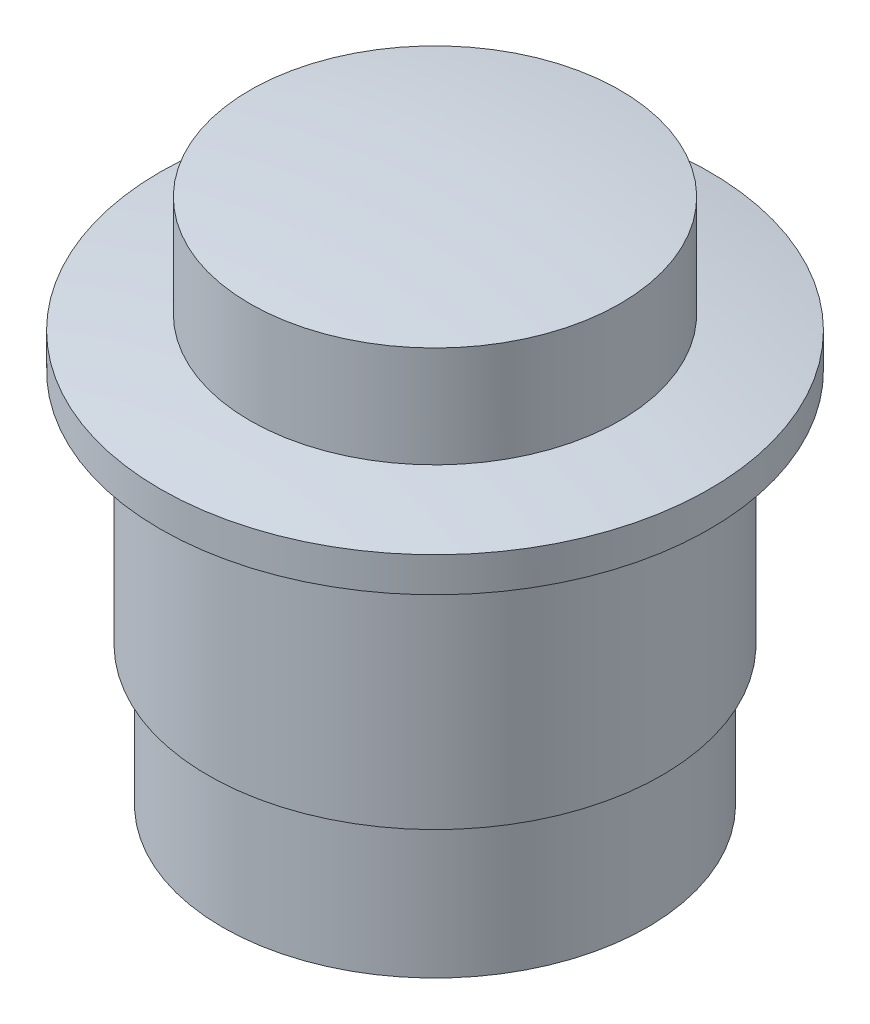
ISO-10303-21;
HEADER;
FILE_DESCRIPTION(('STEP AP214'),'2;1');
FILE_NAME('part.step','',(''),(''),'','','');
FILE_SCHEMA(('AUTOMOTIVE_DESIGN { 1 0 10303 214 1 1 1 1 }'));
ENDSEC;
DATA;
#1=APPLICATION_CONTEXT('core data for automotive mechanical design processes');
#2=APPLICATION_PROTOCOL_DEFINITION('international standard','automotive_design',2000,#1);
#3=PRODUCT_CONTEXT('',#1,'mechanical');
#4=PRODUCT('Part','Part','',(#3));
#5=PRODUCT_RELATED_PRODUCT_CATEGORY('part','',(#4));
#6=PRODUCT_DEFINITION_FORMATION('','',#4);
#7=PRODUCT_DEFINITION_CONTEXT('part definition',#1,'design');
#8=PRODUCT_DEFINITION('design','',#6,#7);
#9=PRODUCT_DEFINITION_SHAPE('','',#8);
#10=(LENGTH_UNIT() NAMED_UNIT(*) SI_UNIT(.MILLI.,.METRE.));
#11=(NAMED_UNIT(*) PLANE_ANGLE_UNIT() SI_UNIT($,.RADIAN.));
#12=(NAMED_UNIT(*) SI_UNIT($,.STERADIAN.) SOLID_ANGLE_UNIT());
#13=UNCERTAINTY_MEASURE_WITH_UNIT(LENGTH_MEASURE(1.E-05),#10,'distance_accuracy_value','');
#14=(GEOMETRIC_REPRESENTATION_CONTEXT(3) GLOBAL_UNCERTAINTY_ASSIGNED_CONTEXT((#13)) GLOBAL_UNIT_ASSIGNED_CONTEXT((#10,
#11,#12)) REPRESENTATION_CONTEXT('',''));
#15=CARTESIAN_POINT('',(0.,0.,0.));
#16=DIRECTION('',(0.,0.,1.));
#17=DIRECTION('',(1.,0.,0.));
#18=AXIS2_PLACEMENT_3D('',#15,#16,#17);
#19=CARTESIAN_POINT('',(0.,4.8,0.));
#20=DIRECTION('',(0.,-1.,0.));
#21=DIRECTION('',(0.,0.,-1.));
#22=AXIS2_PLACEMENT_3D('',#19,#20,#21);
#23=CYLINDRICAL_SURFACE('',#22,7.35);
#24=CARTESIAN_POINT('',(0.,4.8,0.));
#25=DIRECTION('',(0.,1.,0.));
#26=DIRECTION('',(0.,0.,1.));
#27=AXIS2_PLACEMENT_3D('',#24,#25,#26);
#28=CIRCLE('',#27,7.35);
#29=CARTESIAN_POINT('',(0.,4.8,7.35));
#30=VERTEX_POINT('',#29);
#31=EDGE_CURVE('E11',#30,#30,#28,.T.);
#32=ORIENTED_EDGE('',*,*,#31,.F.);
#33=EDGE_LOOP('',(#32));
#34=FACE_BOUND('',#33,.T.);
#35=CARTESIAN_POINT('',(0.,0.,0.));
#36=DIRECTION('',(0.,1.,0.));
#37=DIRECTION('',(0.,0.,1.));
#38=AXIS2_PLACEMENT_3D('',#35,#36,#37);
#39=CIRCLE('',#38,7.35);
#40=CARTESIAN_POINT('',(0.,0.,7.35));
#41=VERTEX_POINT('',#40);
#42=EDGE_CURVE('E39',#41,#41,#39,.T.);
#43=ORIENTED_EDGE('',*,*,#42,.T.);
#44=EDGE_LOOP('',(#43));
#45=FACE_BOUND('',#44,.T.);
#46=ADVANCED_FACE('F36',(#34,#45),#23,.T.);
#47=CARTESIAN_POINT('',(0.,0.,0.));
#48=DIRECTION('',(0.,1.,0.));
#49=DIRECTION('',(0.,0.,1.));
#50=AXIS2_PLACEMENT_3D('',#47,#48,#49);
#51=PLANE('',#50);
#52=ORIENTED_EDGE('',*,*,#42,.F.);
#53=EDGE_LOOP('',(#52));
#54=FACE_BOUND('',#53,.T.);
#55=ADVANCED_FACE('F79',(#54),#51,.F.);
#56=CARTESIAN_POINT('',(0.,48.2031529292576,0.));
#57=DIRECTION('',(0.,-1.,0.));
#58=DIRECTION('',(0.,0.,-1.));
#59=AXIS2_PLACEMENT_3D('',#56,#57,#58);
#60=CYLINDRICAL_SURFACE('',#59,7.85);
#61=CARTESIAN_POINT('',(0.,4.8,0.));
#62=DIRECTION('',(0.,1.,0.));
#63=DIRECTION('',(0.,0.,1.));
#64=AXIS2_PLACEMENT_3D('',#61,#62,#63);
#65=CIRCLE('',#64,7.85);
#66=CARTESIAN_POINT('',(0.,4.80000000000001,-7.85));
#67=VERTEX_POINT('',#66);
#68=EDGE_CURVE('E50',#67,#67,#65,.T.);
#69=CARTESIAN_POINT('',(0.,13.,0.));
#70=DIRECTION('',(0.,1.,0.));
#71=DIRECTION('',(0.,0.,1.));
#72=AXIS2_PLACEMENT_3D('',#69,#70,#71);
#73=CIRCLE('',#72,7.85);
#74=CARTESIAN_POINT('',(0.,13.,-7.85));
#75=VERTEX_POINT('',#74);
#76=EDGE_CURVE('E46',#75,#75,#73,.T.);
#77=CARTESIAN_POINT('',(0.,4.80000000000001,-7.85));
#78=CARTESIAN_POINT('',(0.,4.88541666666667,-7.85));
#79=CARTESIAN_POINT('',(0.,4.97083333333334,-7.85));
#80=CARTESIAN_POINT('',(0.,5.14166666666667,-7.85));
#81=CARTESIAN_POINT('',(0.,5.22708333333334,-7.85));
#82=CARTESIAN_POINT('',(0.,5.39791666666667,-7.85));
#83=CARTESIAN_POINT('',(0.,5.48333333333334,-7.85));
#84=CARTESIAN_POINT('',(0.,5.65416666666667,-7.85));
#85=CARTESIAN_POINT('',(0.,5.73958333333334,-7.85));
#86=CARTESIAN_POINT('',(0.,5.91041666666667,-7.85));
#87=CARTESIAN_POINT('',(0.,5.99583333333334,-7.85));
#88=CARTESIAN_POINT('',(0.,6.16666666666667,-7.85));
#89=CARTESIAN_POINT('',(0.,6.25208333333334,-7.85));
#90=CARTESIAN_POINT('',(0.,6.42291666666667,-7.85));
#91=CARTESIAN_POINT('',(0.,6.50833333333334,-7.85));
#92=CARTESIAN_POINT('',(0.,6.67916666666667,-7.85));
#93=CARTESIAN_POINT('',(0.,6.76458333333334,-7.85));
#94=CARTESIAN_POINT('',(0.,6.93541666666667,-7.85));
#95=CARTESIAN_POINT('',(0.,7.02083333333333,-7.85));
#96=CARTESIAN_POINT('',(0.,7.19166666666667,-7.85));
#97=CARTESIAN_POINT('',(0.,7.27708333333333,-7.85));
#98=CARTESIAN_POINT('',(0.,7.44791666666667,-7.85));
#99=CARTESIAN_POINT('',(0.,7.53333333333333,-7.85));
#100=CARTESIAN_POINT('',(0.,7.70416666666667,-7.85));
#101=CARTESIAN_POINT('',(0.,7.78958333333333,-7.85));
#102=CARTESIAN_POINT('',(0.,7.96041666666667,-7.85));
#103=CARTESIAN_POINT('',(0.,8.04583333333333,-7.85));
#104=CARTESIAN_POINT('',(0.,8.21666666666667,-7.85));
#105=CARTESIAN_POINT('',(0.,8.30208333333333,-7.85));
#106=CARTESIAN_POINT('',(0.,8.47291666666666,-7.85));
#107=CARTESIAN_POINT('',(0.,8.55833333333333,-7.85));
#108=CARTESIAN_POINT('',(0.,8.72916666666666,-7.85));
#109=CARTESIAN_POINT('',(0.,8.81458333333333,-7.85));
#110=CARTESIAN_POINT('',(0.,8.98541666666666,-7.85));
#111=CARTESIAN_POINT('',(0.,9.07083333333333,-7.85));
#112=CARTESIAN_POINT('',(0.,9.24166666666666,-7.85));
#113=CARTESIAN_POINT('',(0.,9.32708333333333,-7.85));
#114=CARTESIAN_POINT('',(0.,9.49791666666666,-7.85));
#115=CARTESIAN_POINT('',(0.,9.58333333333333,-7.85));
#116=CARTESIAN_POINT('',(0.,9.75416666666666,-7.85));
#117=CARTESIAN_POINT('',(0.,9.83958333333333,-7.85));
#118=CARTESIAN_POINT('',(0.,10.0104166666667,-7.85));
#119=CARTESIAN_POINT('',(0.,10.0958333333333,-7.85));
#120=CARTESIAN_POINT('',(0.,10.2666666666667,-7.85));
#121=CARTESIAN_POINT('',(0.,10.3520833333333,-7.85));
#122=CARTESIAN_POINT('',(0.,10.5229166666667,-7.85));
#123=CARTESIAN_POINT('',(0.,10.6083333333333,-7.85));
#124=CARTESIAN_POINT('',(0.,10.7791666666667,-7.85));
#125=CARTESIAN_POINT('',(0.,10.8645833333333,-7.85));
#126=CARTESIAN_POINT('',(0.,11.0354166666667,-7.85));
#127=CARTESIAN_POINT('',(0.,11.1208333333333,-7.85));
#128=CARTESIAN_POINT('',(0.,11.2916666666667,-7.85));
#129=CARTESIAN_POINT('',(0.,11.3770833333333,-7.85));
#130=CARTESIAN_POINT('',(0.,11.5479166666667,-7.85));
#131=CARTESIAN_POINT('',(0.,11.6333333333333,-7.85));
#132=CARTESIAN_POINT('',(0.,11.8041666666667,-7.85));
#133=CARTESIAN_POINT('',(0.,11.8895833333333,-7.85));
#134=CARTESIAN_POINT('',(0.,12.0604166666667,-7.85));
#135=CARTESIAN_POINT('',(0.,12.1458333333333,-7.85));
#136=CARTESIAN_POINT('',(0.,12.3166666666667,-7.85));
#137=CARTESIAN_POINT('',(0.,12.4020833333333,-7.85));
#138=CARTESIAN_POINT('',(0.,12.5729166666667,-7.85));
#139=CARTESIAN_POINT('',(0.,12.6583333333333,-7.85));
#140=CARTESIAN_POINT('',(0.,12.8291666666667,-7.85));
#141=CARTESIAN_POINT('',(0.,12.9145833333333,-7.85));
#142=CARTESIAN_POINT('',(0.,13.,-7.85));
#143=B_SPLINE_CURVE_WITH_KNOTS('',3,(#77,#78,#79,#80,#81,#82,#83,#84,#85,#86,#87,#88,#89,#90,
#91,#92,#93,#94,#95,#96,#97,#98,#99,#100,#101,#102,#103,#104,#105,#106,#107,#108,#109,#110,#111,
#112,#113,#114,#115,#116,#117,#118,#119,#120,#121,#122,#123,#124,#125,#126,#127,#128,#129,#130,
#131,#132,#133,#134,#135,#136,#137,#138,#139,#140,#141,#142),.UNSPECIFIED.,.F.,.F.,(4,2,2,2,2,2,
2,2,2,2,2,2,2,2,2,2,2,2,2,2,2,2,2,2,2,2,2,2,2,2,2,2,4),(0.,0.25625,0.512499999999999,
0.768749999999999,1.025,1.28125,1.5375,1.79375,2.05,2.30625,2.5625,2.81874999999999,
3.07499999999999,3.33124999999999,3.58749999999999,3.84374999999999,4.09999999999999,
4.35624999999999,4.61249999999999,4.86874999999999,5.12499999999999,5.38124999999999,
5.63749999999999,5.89374999999999,6.14999999999999,6.40624999999999,6.66249999999999,
6.91874999999999,7.17499999999999,7.43124999999999,7.68749999999999,7.94374999999999,
8.19999999999999),.UNSPECIFIED.);
#144=EDGE_CURVE('BSEAM84',#67,#75,#143,.T.);
#145=ORIENTED_EDGE('',*,*,#68,.T.);
#146=ORIENTED_EDGE('',*,*,#76,.F.);
#147=ORIENTED_EDGE('',*,*,#144,.T.);
#148=ORIENTED_EDGE('',*,*,#144,.F.);
#149=EDGE_LOOP('',(#145,#147,#146,#148));
#150=FACE_BOUND('',#149,.T.);
#151=ADVANCED_FACE('F84',(#150),#60,.T.);
#152=CARTESIAN_POINT('',(0.,4.8,0.));
#153=DIRECTION('',(0.,1.,0.));
#154=DIRECTION('',(0.,0.,1.));
#155=AXIS2_PLACEMENT_3D('',#152,#153,#154);
#156=PLANE('',#155);
#157=ORIENTED_EDGE('',*,*,#31,.T.);
#158=EDGE_LOOP('',(#157));
#159=FACE_BOUND('',#158,.T.);
#160=ORIENTED_EDGE('',*,*,#68,.F.);
#161=EDGE_LOOP('',(#160));
#162=FACE_BOUND('',#161,.T.);
#163=ADVANCED_FACE('F91',(#159,#162),#156,.F.);
#164=CARTESIAN_POINT('',(0.,-31.3892045158607,0.));
#165=DIRECTION('',(0.,1.,0.));
#166=DIRECTION('',(1.,0.,0.));
#167=AXIS2_PLACEMENT_3D('',#164,#165,#166);
#168=SPHERICAL_SURFACE('',#167,50.);
#169=CARTESIAN_POINT('',(0.,18.1995038762723,0.));
#170=DIRECTION('',(0.,1.,0.));
#171=DIRECTION('',(0.,0.,1.));
#172=AXIS2_PLACEMENT_3D('',#169,#170,#171);
#173=CIRCLE('',#172,6.4);
#174=CARTESIAN_POINT('',(0.,18.1995038762723,6.4));
#175=VERTEX_POINT('',#174);
#176=EDGE_CURVE('E53',#175,#175,#173,.T.);
#177=ORIENTED_EDGE('',*,*,#176,.T.);
#178=EDGE_LOOP('',(#177));
#179=FACE_BOUND('',#178,.T.);
#180=ADVANCED_FACE('F97',(#179),#168,.T.);
#181=CARTESIAN_POINT('',(0.,15.2008910011442,0.));
#182=DIRECTION('',(0.,1.,0.));
#183=DIRECTION('',(0.,0.,1.));
#184=AXIS2_PLACEMENT_3D('',#181,#182,#183);
#185=CYLINDRICAL_SURFACE('',#184,6.4);
#186=ORIENTED_EDGE('',*,*,#176,.F.);
#187=EDGE_LOOP('',(#186));
#188=FACE_BOUND('',#187,.T.);
#189=CARTESIAN_POINT('',(0.,14.6995038762723,0.));
#190=DIRECTION('',(0.,1.,0.));
#191=DIRECTION('',(0.,0.,1.));
#192=AXIS2_PLACEMENT_3D('',#189,#190,#191);
#193=CIRCLE('',#192,6.4);
#194=CARTESIAN_POINT('',(-6.4,14.6995038762723,0.));
#195=VERTEX_POINT('',#194);
#196=EDGE_CURVE('E56',#195,#195,#193,.T.);
#197=ORIENTED_EDGE('',*,*,#196,.T.);
#198=EDGE_LOOP('',(#197));
#199=FACE_BOUND('',#198,.T.);
#200=ADVANCED_FACE('F100',(#188,#199),#185,.T.);
#201=CARTESIAN_POINT('',(0.,-34.8892045158607,0.));
#202=DIRECTION('',(0.,1.,0.));
#203=DIRECTION('',(-1.,0.,0.));
#204=AXIS2_PLACEMENT_3D('',#201,#202,#203);
#205=SPHERICAL_SURFACE('',#204,50.);
#206=CARTESIAN_POINT('',(0.,14.2,0.));
#207=DIRECTION('',(0.,1.,0.));
#208=DIRECTION('',(0.,0.,1.));
#209=AXIS2_PLACEMENT_3D('',#206,#207,#208);
#210=CIRCLE('',#209,9.5);
#211=CARTESIAN_POINT('',(-9.5,14.2,0.));
#212=VERTEX_POINT('',#211);
#213=EDGE_CURVE('E59',#212,#212,#210,.T.);
#214=CARTESIAN_POINT('',(-9.5,14.2,0.));
#215=CARTESIAN_POINT('',(-9.46788235564776,14.2062155748209,0.));
#216=CARTESIAN_POINT('',(-9.43575861127334,14.2123996290898,0.));
#217=CARTESIAN_POINT('',(-9.37149904627785,14.2247046728902,0.));
#218=CARTESIAN_POINT('',(-9.33936322565677,14.2308256624218,0.));
#219=CARTESIAN_POINT('',(-9.27507963196569,14.2430045531142,0.));
#220=CARTESIAN_POINT('',(-9.24293185889568,14.2490624542752,0.));
#221=CARTESIAN_POINT('',(-9.17862448416298,14.2611151449013,0.));
#222=CARTESIAN_POINT('',(-9.14646488250028,14.2671099343665,0.));
#223=CARTESIAN_POINT('',(-9.08213397448066,14.2790363785018,0.));
#224=CARTESIAN_POINT('',(-9.04996266812373,14.2849680331718,0.));
#225=CARTESIAN_POINT('',(-8.98560847466012,14.2967681848653,0.));
#226=CARTESIAN_POINT('',(-8.95342558755342,14.3026366818887,0.));
#227=CARTESIAN_POINT('',(-8.8890483565791,14.3143104956794,0.));
#228=CARTESIAN_POINT('',(-8.85685401271148,14.3201158124467,0.));
#229=CARTESIAN_POINT('',(-8.79245399224833,14.3316632433595,0.));
#230=CARTESIAN_POINT('',(-8.76024831565281,14.3374053575051,0.));
#231=CARTESIAN_POINT('',(-8.69582575381055,14.3488263610521,0.));
#232=CARTESIAN_POINT('',(-8.66360886856381,14.3545052504535,0.));
#233=CARTESIAN_POINT('',(-8.59916401353898,14.3657997826337,0.));
#234=CARTESIAN_POINT('',(-8.5669360437609,14.3714154254125,0.));
#235=CARTESIAN_POINT('',(-8.50246914383594,14.3825834427122,0.));
#236=CARTESIAN_POINT('',(-8.47023021368907,14.3881358172332,0.));
#237=CARTESIAN_POINT('',(-8.40574151723135,14.3991772766261,0.));
#238=CARTESIAN_POINT('',(-8.37349175092051,14.404666361498,0.));
#239=CARTESIAN_POINT('',(-8.30898150638138,14.4155812204455,0.));
#240=CARTESIAN_POINT('',(-8.2767210281531,14.421006994521,0.));
#241=CARTESIAN_POINT('',(-8.21218948406691,14.431795210972,0.));
#242=CARTESIAN_POINT('',(-8.17991841820901,14.4371576533475,0.));
#243=CARTESIAN_POINT('',(-8.11536582319219,14.447819185739,0.));
#244=CARTESIAN_POINT('',(-8.08308429403328,14.453118275755,0.));
#245=CARTESIAN_POINT('',(-8.01851089678335,14.4636530830121,0.));
#246=CARTESIAN_POINT('',(-7.98621902869233,14.4688888002531,0.));
#247=CARTESIAN_POINT('',(-7.92162507798695,14.479296841789,0.));
#248=CARTESIAN_POINT('',(-7.88932299537259,14.4844691660838,0.));
#249=CARTESIAN_POINT('',(-7.82470874006861,14.4947504018,0.));
#250=CARTESIAN_POINT('',(-7.79239656737899,14.4998593132214,0.));
#251=CARTESIAN_POINT('',(-7.72776225641149,14.5100137035082,0.));
#252=CARTESIAN_POINT('',(-7.69544011813359,14.5150591823736,0.));
#253=CARTESIAN_POINT('',(-7.6307860005149,14.5250866881098,0.));
#254=CARTESIAN_POINT('',(-7.59845402117411,14.5300687149807,0.));
#255=CARTESIAN_POINT('',(-7.53378034599289,14.539969297534,0.));
#256=CARTESIAN_POINT('',(-7.50143865015247,14.5448878532164,0.));
#257=CARTESIAN_POINT('',(-7.43674566657271,14.5546614744435,0.));
#258=CARTESIAN_POINT('',(-7.40439437883338,14.5595165399882,0.));
#259=CARTESIAN_POINT('',(-7.33968233609348,14.5691631622349,0.));
#260=CARTESIAN_POINT('',(-7.30732158109291,14.5739547189369,0.));
#261=CARTESIAN_POINT('',(-7.24259072850469,14.5834743050383,0.));
#262=CARTESIAN_POINT('',(-7.21022063091703,14.5882023344376,0.));
#263=CARTESIAN_POINT('',(-7.14547121786475,14.5975948477182,0.));
#264=CARTESIAN_POINT('',(-7.11309190240013,14.6022593315995,0.));
#265=CARTESIAN_POINT('',(-7.0483241783396,14.6115247358734,0.));
#266=CARTESIAN_POINT('',(-7.01593576974368,14.616125656266,0.));
#267=CARTESIAN_POINT('',(-6.95114998420121,14.625263915837,0.));
#268=CARTESIAN_POINT('',(-6.91875260725466,14.6298012550153,0.));
#269=CARTESIAN_POINT('',(-6.8539490098262,14.6388123346771,0.));
#270=CARTESIAN_POINT('',(-6.8215427893443,14.6432860751606,0.));
#271=CARTESIAN_POINT('',(-6.7567216296943,14.6521699401962,0.));
#272=CARTESIAN_POINT('',(-6.72430669052621,14.6565800647483,0.));
#273=CARTESIAN_POINT('',(-6.65946821838723,14.665336680934,0.));
#274=CARTESIAN_POINT('',(-6.62704468541634,14.6696831725677,0.));
#275=CARTESIAN_POINT('',(-6.56218915058595,14.6783125061575,0.));
#276=CARTESIAN_POINT('',(-6.52975714872645,14.6825953481135,0.));
#277=CARTESIAN_POINT('',(-6.46488480107426,14.6910973658995,0.));
#278=CARTESIAN_POINT('',(-6.43244445528157,14.6953165417295,0.));
#279=CARTESIAN_POINT('',(-6.4,14.6995038762723,0.));
#280=B_SPLINE_CURVE_WITH_KNOTS('',3,(#214,#215,#216,#217,#218,#219,#220,#221,#222,#223,#224,
#225,#226,#227,#228,#229,#230,#231,#232,#233,#234,#235,#236,#237,#238,#239,#240,#241,#242,#243,
#244,#245,#246,#247,#248,#249,#250,#251,#252,#253,#254,#255,#256,#257,#258,#259,#260,#261,#262,
#263,#264,#265,#266,#267,#268,#269,#270,#271,#272,#273,#274,#275,#276,#277,#278,#279),
.UNSPECIFIED.,.F.,.F.,(4,2,2,2,2,2,2,2,2,2,2,2,2,2,2,2,2,2,2,2,2,2,2,2,2,2,2,2,2,2,2,2,4),(0.,
0.0981406386239612,0.19628127724792,0.294421915871891,0.392562554495851,0.490703193119809,
0.588843831743782,0.686984470367742,0.785125108991702,0.883265747615662,0.981406386239621,
1.07954702486359,1.17768766348755,1.27582830211151,1.37396894073548,1.47210957935944,
1.5702502179834,1.66839085660736,1.76653149523132,1.86467213385529,1.96281277247925,
2.06095341110321,2.15909404972718,2.25723468835114,2.3553753269751,2.45351596559906,
2.55165660422302,2.64979724284699,2.74793788147095,2.84607852009491,2.94421915871888,
3.04235979734284,3.1405004359668),.UNSPECIFIED.);
#281=EDGE_CURVE('BSEAM75',#212,#195,#280,.T.);
#282=ORIENTED_EDGE('',*,*,#213,.T.);
#283=ORIENTED_EDGE('',*,*,#196,.F.);
#284=ORIENTED_EDGE('',*,*,#281,.T.);
#285=ORIENTED_EDGE('',*,*,#281,.F.);
#286=EDGE_LOOP('',(#282,#284,#283,#285));
#287=FACE_BOUND('',#286,.T.);
#288=ADVANCED_FACE('F75',(#287),#205,.T.);
#289=CARTESIAN_POINT('',(0.,15.2008910011442,0.));
#290=DIRECTION('',(0.,1.,0.));
#291=DIRECTION('',(0.,0.,1.));
#292=AXIS2_PLACEMENT_3D('',#289,#290,#291);
#293=CYLINDRICAL_SURFACE('',#292,9.5);
#294=ORIENTED_EDGE('',*,*,#213,.F.);
#295=EDGE_LOOP('',(#294));
#296=FACE_BOUND('',#295,.T.);
#297=CARTESIAN_POINT('',(0.,13.,0.));
#298=DIRECTION('',(0.,1.,0.));
#299=DIRECTION('',(0.,0.,1.));
#300=AXIS2_PLACEMENT_3D('',#297,#298,#299);
#301=CIRCLE('',#300,9.5);
#302=CARTESIAN_POINT('',(0.,13.,9.5));
#303=VERTEX_POINT('',#302);
#304=EDGE_CURVE('E62',#303,#303,#301,.T.);
#305=ORIENTED_EDGE('',*,*,#304,.T.);
#306=EDGE_LOOP('',(#305));
#307=FACE_BOUND('',#306,.T.);
#308=ADVANCED_FACE('F66',(#296,#307),#293,.T.);
#309=CARTESIAN_POINT('',(0.,13.,0.));
#310=DIRECTION('',(0.,1.,0.));
#311=DIRECTION('',(0.,0.,1.));
#312=AXIS2_PLACEMENT_3D('',#309,#310,#311);
#313=PLANE('',#312);
#314=ORIENTED_EDGE('',*,*,#76,.T.);
#315=EDGE_LOOP('',(#314));
#316=FACE_BOUND('',#315,.T.);
#317=ORIENTED_EDGE('',*,*,#304,.F.);
#318=EDGE_LOOP('',(#317));
#319=FACE_BOUND('',#318,.T.);
#320=ADVANCED_FACE('F68',(#316,#319),#313,.F.);
#321=CLOSED_SHELL('',(#46,#55,#151,#163,#180,#200,#288,#308,#320));
#322=MANIFOLD_SOLID_BREP('B2',#321);
#323=ADVANCED_BREP_SHAPE_REPRESENTATION('',(#18,#322),#14);
#324=SHAPE_DEFINITION_REPRESENTATION(#9,#323);
ENDSEC;
END-ISO-10303-21;
